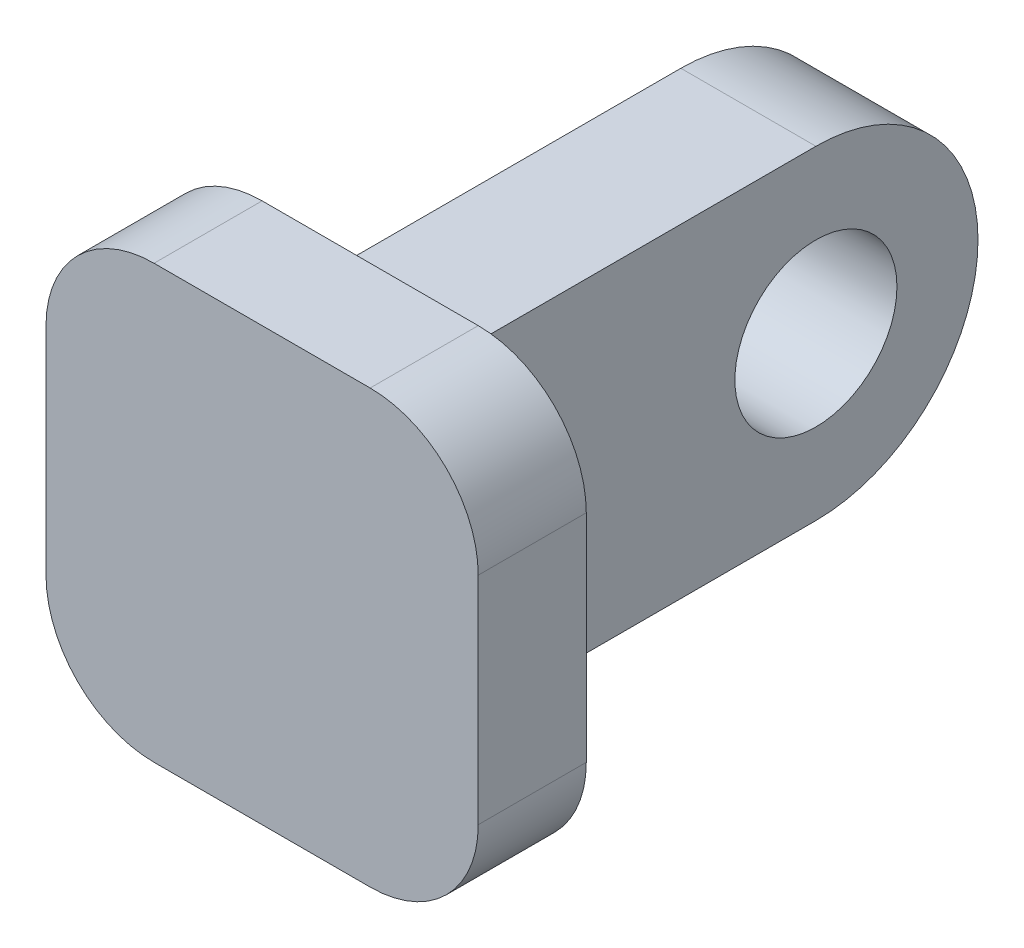
ISO-10303-21;
HEADER;
FILE_DESCRIPTION(('STEP AP214'),'2;1');
FILE_NAME('part.step','',(''),(''),'','','');
FILE_SCHEMA(('AUTOMOTIVE_DESIGN { 1 0 10303 214 1 1 1 1 }'));
ENDSEC;
DATA;
#1=APPLICATION_CONTEXT('core data for automotive mechanical design processes');
#2=APPLICATION_PROTOCOL_DEFINITION('international standard','automotive_design',2000,#1);
#3=PRODUCT_CONTEXT('',#1,'mechanical');
#4=PRODUCT('Part','Part','',(#3));
#5=PRODUCT_RELATED_PRODUCT_CATEGORY('part','',(#4));
#6=PRODUCT_DEFINITION_FORMATION('','',#4);
#7=PRODUCT_DEFINITION_CONTEXT('part definition',#1,'design');
#8=PRODUCT_DEFINITION('design','',#6,#7);
#9=PRODUCT_DEFINITION_SHAPE('','',#8);
#10=(LENGTH_UNIT() NAMED_UNIT(*) SI_UNIT(.MILLI.,.METRE.));
#11=(NAMED_UNIT(*) PLANE_ANGLE_UNIT() SI_UNIT($,.RADIAN.));
#12=(NAMED_UNIT(*) SI_UNIT($,.STERADIAN.) SOLID_ANGLE_UNIT());
#13=UNCERTAINTY_MEASURE_WITH_UNIT(LENGTH_MEASURE(1.E-05),#10,'distance_accuracy_value','');
#14=(GEOMETRIC_REPRESENTATION_CONTEXT(3) GLOBAL_UNCERTAINTY_ASSIGNED_CONTEXT((#13)) GLOBAL_UNIT_ASSIGNED_CONTEXT((#10,
#11,#12)) REPRESENTATION_CONTEXT('',''));
#15=CARTESIAN_POINT('',(0.,0.,0.));
#16=DIRECTION('',(0.,0.,1.));
#17=DIRECTION('',(1.,0.,0.));
#18=AXIS2_PLACEMENT_3D('',#15,#16,#17);
#19=CARTESIAN_POINT('',(-4.,4.,1.));
#20=DIRECTION('',(1.,0.,0.));
#21=DIRECTION('',(0.,1.,0.));
#22=AXIS2_PLACEMENT_3D('',#19,#20,#21);
#23=PLANE('',#22);
#24=DIRECTION('',(0.,-1.,0.));
#25=VECTOR('',#24,1.);
#26=CARTESIAN_POINT('',(-4.,4.,-1.));
#27=LINE('',#26,#25);
#28=CARTESIAN_POINT('',(-4.,2.,-1.));
#29=VERTEX_POINT('',#28);
#30=CARTESIAN_POINT('',(-4.,-2.,-1.));
#31=VERTEX_POINT('',#30);
#32=EDGE_CURVE('E149',#29,#31,#27,.T.);
#33=ORIENTED_EDGE('',*,*,#32,.T.);
#34=DIRECTION('',(0.,0.,-1.));
#35=VECTOR('',#34,1.);
#36=CARTESIAN_POINT('',(-4.,-2.,1.));
#37=LINE('',#36,#35);
#38=CARTESIAN_POINT('',(-4.,-2.,1.));
#39=VERTEX_POINT('',#38);
#40=EDGE_CURVE('E205',#31,#39,#37,.F.);
#41=ORIENTED_EDGE('',*,*,#40,.T.);
#42=DIRECTION('',(0.,-1.,0.));
#43=VECTOR('',#42,1.);
#44=CARTESIAN_POINT('',(-4.,4.,1.));
#45=LINE('',#44,#43);
#46=CARTESIAN_POINT('',(-4.,2.,1.));
#47=VERTEX_POINT('',#46);
#48=EDGE_CURVE('E158',#47,#39,#45,.T.);
#49=ORIENTED_EDGE('',*,*,#48,.F.);
#50=DIRECTION('',(0.,0.,-1.));
#51=VECTOR('',#50,1.);
#52=CARTESIAN_POINT('',(-4.,2.,1.));
#53=LINE('',#52,#51);
#54=EDGE_CURVE('E202',#47,#29,#53,.T.);
#55=ORIENTED_EDGE('',*,*,#54,.T.);
#56=EDGE_LOOP('',(#33,#41,#49,#55));
#57=FACE_BOUND('',#56,.T.);
#58=ADVANCED_FACE('F35',(#57),#23,.F.);
#59=CARTESIAN_POINT('',(-4.,-4.,1.));
#60=DIRECTION('',(0.,1.,0.));
#61=DIRECTION('',(0.,0.,1.));
#62=AXIS2_PLACEMENT_3D('',#59,#60,#61);
#63=PLANE('',#62);
#64=DIRECTION('',(1.,0.,0.));
#65=VECTOR('',#64,1.);
#66=CARTESIAN_POINT('',(-4.,-4.,-1.));
#67=LINE('',#66,#65);
#68=CARTESIAN_POINT('',(-2.,-4.,-1.));
#69=VERTEX_POINT('',#68);
#70=CARTESIAN_POINT('',(2.,-4.,-1.));
#71=VERTEX_POINT('',#70);
#72=EDGE_CURVE('E152',#69,#71,#67,.T.);
#73=ORIENTED_EDGE('',*,*,#72,.T.);
#74=DIRECTION('',(0.,0.,-1.));
#75=VECTOR('',#74,1.);
#76=CARTESIAN_POINT('',(2.,-4.,1.));
#77=LINE('',#76,#75);
#78=CARTESIAN_POINT('',(2.,-4.,1.));
#79=VERTEX_POINT('',#78);
#80=EDGE_CURVE('E192',#71,#79,#77,.F.);
#81=ORIENTED_EDGE('',*,*,#80,.T.);
#82=DIRECTION('',(1.,0.,0.));
#83=VECTOR('',#82,1.);
#84=CARTESIAN_POINT('',(-4.,-4.,1.));
#85=LINE('',#84,#83);
#86=CARTESIAN_POINT('',(-2.,-4.,1.));
#87=VERTEX_POINT('',#86);
#88=EDGE_CURVE('E161',#87,#79,#85,.T.);
#89=ORIENTED_EDGE('',*,*,#88,.F.);
#90=DIRECTION('',(0.,0.,-1.));
#91=VECTOR('',#90,1.);
#92=CARTESIAN_POINT('',(-2.,-4.,1.));
#93=LINE('',#92,#91);
#94=EDGE_CURVE('E189',#87,#69,#93,.T.);
#95=ORIENTED_EDGE('',*,*,#94,.T.);
#96=EDGE_LOOP('',(#73,#81,#89,#95));
#97=FACE_BOUND('',#96,.T.);
#98=ADVANCED_FACE('F231',(#97),#63,.F.);
#99=CARTESIAN_POINT('',(4.,4.,1.));
#100=DIRECTION('',(-1.,0.,0.));
#101=DIRECTION('',(0.,0.,1.));
#102=AXIS2_PLACEMENT_3D('',#99,#100,#101);
#103=PLANE('',#102);
#104=DIRECTION('',(0.,1.,0.));
#105=VECTOR('',#104,1.);
#106=CARTESIAN_POINT('',(4.,4.,1.));
#107=LINE('',#106,#105);
#108=CARTESIAN_POINT('',(4.,-2.,1.));
#109=VERTEX_POINT('',#108);
#110=CARTESIAN_POINT('',(4.,2.,1.));
#111=VERTEX_POINT('',#110);
#112=EDGE_CURVE('E165',#109,#111,#107,.T.);
#113=ORIENTED_EDGE('',*,*,#112,.F.);
#114=DIRECTION('',(0.,0.,-1.));
#115=VECTOR('',#114,1.);
#116=CARTESIAN_POINT('',(4.,-2.,1.));
#117=LINE('',#116,#115);
#118=CARTESIAN_POINT('',(4.,-2.,-1.));
#119=VERTEX_POINT('',#118);
#120=EDGE_CURVE('E178',#109,#119,#117,.T.);
#121=ORIENTED_EDGE('',*,*,#120,.T.);
#122=DIRECTION('',(0.,1.,0.));
#123=VECTOR('',#122,1.);
#124=CARTESIAN_POINT('',(4.,4.,-1.));
#125=LINE('',#124,#123);
#126=CARTESIAN_POINT('',(4.,2.,-1.));
#127=VERTEX_POINT('',#126);
#128=EDGE_CURVE('E173',#119,#127,#125,.T.);
#129=ORIENTED_EDGE('',*,*,#128,.T.);
#130=DIRECTION('',(0.,0.,-1.));
#131=VECTOR('',#130,1.);
#132=CARTESIAN_POINT('',(4.,2.,1.));
#133=LINE('',#132,#131);
#134=EDGE_CURVE('E169',#127,#111,#133,.F.);
#135=ORIENTED_EDGE('',*,*,#134,.T.);
#136=EDGE_LOOP('',(#113,#121,#129,#135));
#137=FACE_BOUND('',#136,.T.);
#138=ADVANCED_FACE('F239',(#137),#103,.F.);
#139=CARTESIAN_POINT('',(-4.,4.,1.));
#140=DIRECTION('',(0.,-1.,0.));
#141=DIRECTION('',(0.,0.,-1.));
#142=AXIS2_PLACEMENT_3D('',#139,#140,#141);
#143=PLANE('',#142);
#144=DIRECTION('',(-1.,0.,0.));
#145=VECTOR('',#144,1.);
#146=CARTESIAN_POINT('',(-4.,4.,-1.));
#147=LINE('',#146,#145);
#148=CARTESIAN_POINT('',(2.,4.,-1.));
#149=VERTEX_POINT('',#148);
#150=CARTESIAN_POINT('',(-2.,4.,-1.));
#151=VERTEX_POINT('',#150);
#152=EDGE_CURVE('E162',#149,#151,#147,.T.);
#153=ORIENTED_EDGE('',*,*,#152,.T.);
#154=DIRECTION('',(0.,0.,-1.));
#155=VECTOR('',#154,1.);
#156=CARTESIAN_POINT('',(-2.,4.,1.));
#157=LINE('',#156,#155);
#158=CARTESIAN_POINT('',(-2.,4.,1.));
#159=VERTEX_POINT('',#158);
#160=EDGE_CURVE('E11',#151,#159,#157,.F.);
#161=ORIENTED_EDGE('',*,*,#160,.T.);
#162=DIRECTION('',(-1.,0.,0.));
#163=VECTOR('',#162,1.);
#164=CARTESIAN_POINT('',(-4.,4.,1.));
#165=LINE('',#164,#163);
#166=CARTESIAN_POINT('',(2.,4.,1.));
#167=VERTEX_POINT('',#166);
#168=EDGE_CURVE('E168',#167,#159,#165,.T.);
#169=ORIENTED_EDGE('',*,*,#168,.F.);
#170=DIRECTION('',(0.,0.,-1.));
#171=VECTOR('',#170,1.);
#172=CARTESIAN_POINT('',(2.,4.,1.));
#173=LINE('',#172,#171);
#174=EDGE_CURVE('E44',#167,#149,#173,.T.);
#175=ORIENTED_EDGE('',*,*,#174,.T.);
#176=EDGE_LOOP('',(#153,#161,#169,#175));
#177=FACE_BOUND('',#176,.T.);
#178=ADVANCED_FACE('F210',(#177),#143,.F.);
#179=CARTESIAN_POINT('',(0.,0.,1.));
#180=DIRECTION('',(0.,0.,1.));
#181=DIRECTION('',(1.,0.,0.));
#182=AXIS2_PLACEMENT_3D('',#179,#180,#181);
#183=PLANE('',#182);
#184=ORIENTED_EDGE('',*,*,#88,.T.);
#185=CARTESIAN_POINT('',(2.,-2.,1.));
#186=DIRECTION('',(0.,0.,1.));
#187=DIRECTION('',(1.,0.,0.));
#188=AXIS2_PLACEMENT_3D('',#185,#186,#187);
#189=CIRCLE('',#188,2.);
#190=EDGE_CURVE('E200',#79,#109,#189,.T.);
#191=ORIENTED_EDGE('',*,*,#190,.T.);
#192=ORIENTED_EDGE('',*,*,#112,.T.);
#193=CARTESIAN_POINT('',(2.,2.,1.));
#194=DIRECTION('',(0.,0.,1.));
#195=DIRECTION('',(1.,0.,0.));
#196=AXIS2_PLACEMENT_3D('',#193,#194,#195);
#197=CIRCLE('',#196,2.);
#198=EDGE_CURVE('E194',#111,#167,#197,.T.);
#199=ORIENTED_EDGE('',*,*,#198,.T.);
#200=ORIENTED_EDGE('',*,*,#168,.T.);
#201=CARTESIAN_POINT('',(-2.,2.,1.));
#202=DIRECTION('',(0.,0.,1.));
#203=DIRECTION('',(1.,0.,0.));
#204=AXIS2_PLACEMENT_3D('',#201,#202,#203);
#205=CIRCLE('',#204,2.);
#206=EDGE_CURVE('E196',#159,#47,#205,.T.);
#207=ORIENTED_EDGE('',*,*,#206,.T.);
#208=ORIENTED_EDGE('',*,*,#48,.T.);
#209=CARTESIAN_POINT('',(-2.,-2.,1.));
#210=DIRECTION('',(0.,0.,1.));
#211=DIRECTION('',(1.,0.,0.));
#212=AXIS2_PLACEMENT_3D('',#209,#210,#211);
#213=CIRCLE('',#212,2.);
#214=EDGE_CURVE('E198',#39,#87,#213,.T.);
#215=ORIENTED_EDGE('',*,*,#214,.T.);
#216=EDGE_LOOP('',(#184,#191,#192,#199,#200,#207,#208,#215));
#217=FACE_BOUND('',#216,.T.);
#218=ADVANCED_FACE('F224',(#217),#183,.T.);
#219=CARTESIAN_POINT('',(0.,0.,-1.));
#220=DIRECTION('',(0.,0.,1.));
#221=DIRECTION('',(1.,0.,0.));
#222=AXIS2_PLACEMENT_3D('',#219,#220,#221);
#223=PLANE('',#222);
#224=DIRECTION('',(-1.,0.,0.));
#225=VECTOR('',#224,1.);
#226=CARTESIAN_POINT('',(1.25,3.,-1.));
#227=LINE('',#226,#225);
#228=CARTESIAN_POINT('',(1.25,3.,-1.));
#229=VERTEX_POINT('',#228);
#230=CARTESIAN_POINT('',(-1.25,3.,-1.));
#231=VERTEX_POINT('',#230);
#232=EDGE_CURVE('E387',#229,#231,#227,.T.);
#233=ORIENTED_EDGE('',*,*,#232,.T.);
#234=DIRECTION('',(0.,-1.,0.));
#235=VECTOR('',#234,1.);
#236=CARTESIAN_POINT('',(-1.25,3.,-1.));
#237=LINE('',#236,#235);
#238=CARTESIAN_POINT('',(-1.25,-3.,-1.));
#239=VERTEX_POINT('',#238);
#240=EDGE_CURVE('E51',#231,#239,#237,.T.);
#241=ORIENTED_EDGE('',*,*,#240,.T.);
#242=DIRECTION('',(-1.,0.,0.));
#243=VECTOR('',#242,1.);
#244=CARTESIAN_POINT('',(1.25,-3.,-1.));
#245=LINE('',#244,#243);
#246=CARTESIAN_POINT('',(1.25,-3.,-1.));
#247=VERTEX_POINT('',#246);
#248=EDGE_CURVE('E130',#247,#239,#245,.T.);
#249=ORIENTED_EDGE('',*,*,#248,.F.);
#250=DIRECTION('',(0.,-1.,0.));
#251=VECTOR('',#250,1.);
#252=CARTESIAN_POINT('',(1.25,3.,-1.));
#253=LINE('',#252,#251);
#254=EDGE_CURVE('E136',#229,#247,#253,.T.);
#255=ORIENTED_EDGE('',*,*,#254,.F.);
#256=EDGE_LOOP('',(#233,#241,#249,#255));
#257=FACE_BOUND('',#256,.T.);
#258=ORIENTED_EDGE('',*,*,#128,.F.);
#259=CARTESIAN_POINT('',(2.,-2.,-1.));
#260=DIRECTION('',(0.,0.,1.));
#261=DIRECTION('',(1.,0.,0.));
#262=AXIS2_PLACEMENT_3D('',#259,#260,#261);
#263=CIRCLE('',#262,2.);
#264=EDGE_CURVE('E187',#119,#71,#263,.F.);
#265=ORIENTED_EDGE('',*,*,#264,.T.);
#266=ORIENTED_EDGE('',*,*,#72,.F.);
#267=CARTESIAN_POINT('',(-2.,-2.,-1.));
#268=DIRECTION('',(0.,0.,1.));
#269=DIRECTION('',(1.,0.,0.));
#270=AXIS2_PLACEMENT_3D('',#267,#268,#269);
#271=CIRCLE('',#270,2.);
#272=EDGE_CURVE('E185',#69,#31,#271,.F.);
#273=ORIENTED_EDGE('',*,*,#272,.T.);
#274=ORIENTED_EDGE('',*,*,#32,.F.);
#275=CARTESIAN_POINT('',(-2.,2.,-1.));
#276=DIRECTION('',(0.,0.,1.));
#277=DIRECTION('',(1.,0.,0.));
#278=AXIS2_PLACEMENT_3D('',#275,#276,#277);
#279=CIRCLE('',#278,2.);
#280=EDGE_CURVE('E183',#29,#151,#279,.F.);
#281=ORIENTED_EDGE('',*,*,#280,.T.);
#282=ORIENTED_EDGE('',*,*,#152,.F.);
#283=CARTESIAN_POINT('',(2.,2.,-1.));
#284=DIRECTION('',(0.,0.,1.));
#285=DIRECTION('',(1.,0.,0.));
#286=AXIS2_PLACEMENT_3D('',#283,#284,#285);
#287=CIRCLE('',#286,2.);
#288=EDGE_CURVE('E181',#149,#127,#287,.F.);
#289=ORIENTED_EDGE('',*,*,#288,.T.);
#290=EDGE_LOOP('',(#258,#265,#266,#273,#274,#281,#282,#289));
#291=FACE_BOUND('',#290,.T.);
#292=ADVANCED_FACE('F147',(#257,#291),#223,.F.);
#293=CARTESIAN_POINT('',(2.,-2.,1.));
#294=DIRECTION('',(0.,0.,-1.));
#295=DIRECTION('',(-1.,0.,0.));
#296=AXIS2_PLACEMENT_3D('',#293,#294,#295);
#297=CYLINDRICAL_SURFACE('',#296,2.);
#298=ORIENTED_EDGE('',*,*,#190,.F.);
#299=ORIENTED_EDGE('',*,*,#80,.F.);
#300=ORIENTED_EDGE('',*,*,#264,.F.);
#301=ORIENTED_EDGE('',*,*,#120,.F.);
#302=EDGE_LOOP('',(#298,#299,#300,#301));
#303=FACE_BOUND('',#302,.T.);
#304=ADVANCED_FACE('F236',(#303),#297,.T.);
#305=CARTESIAN_POINT('',(-2.,-2.,1.));
#306=DIRECTION('',(0.,0.,-1.));
#307=DIRECTION('',(-1.,0.,0.));
#308=AXIS2_PLACEMENT_3D('',#305,#306,#307);
#309=CYLINDRICAL_SURFACE('',#308,2.);
#310=ORIENTED_EDGE('',*,*,#214,.F.);
#311=ORIENTED_EDGE('',*,*,#40,.F.);
#312=ORIENTED_EDGE('',*,*,#272,.F.);
#313=ORIENTED_EDGE('',*,*,#94,.F.);
#314=EDGE_LOOP('',(#310,#311,#312,#313));
#315=FACE_BOUND('',#314,.T.);
#316=ADVANCED_FACE('F228',(#315),#309,.T.);
#317=CARTESIAN_POINT('',(-2.,2.,1.));
#318=DIRECTION('',(0.,0.,-1.));
#319=DIRECTION('',(-1.,0.,0.));
#320=AXIS2_PLACEMENT_3D('',#317,#318,#319);
#321=CYLINDRICAL_SURFACE('',#320,2.);
#322=ORIENTED_EDGE('',*,*,#206,.F.);
#323=ORIENTED_EDGE('',*,*,#160,.F.);
#324=ORIENTED_EDGE('',*,*,#280,.F.);
#325=ORIENTED_EDGE('',*,*,#54,.F.);
#326=EDGE_LOOP('',(#322,#323,#324,#325));
#327=FACE_BOUND('',#326,.T.);
#328=ADVANCED_FACE('F218',(#327),#321,.T.);
#329=CARTESIAN_POINT('',(2.,2.,1.));
#330=DIRECTION('',(0.,0.,-1.));
#331=DIRECTION('',(-1.,0.,0.));
#332=AXIS2_PLACEMENT_3D('',#329,#330,#331);
#333=CYLINDRICAL_SURFACE('',#332,2.);
#334=ORIENTED_EDGE('',*,*,#198,.F.);
#335=ORIENTED_EDGE('',*,*,#134,.F.);
#336=ORIENTED_EDGE('',*,*,#288,.F.);
#337=ORIENTED_EDGE('',*,*,#174,.F.);
#338=EDGE_LOOP('',(#334,#335,#336,#337));
#339=FACE_BOUND('',#338,.T.);
#340=ADVANCED_FACE('F37',(#339),#333,.T.);
#341=CARTESIAN_POINT('',(1.25,-3.,-1.));
#342=DIRECTION('',(0.,1.,0.));
#343=DIRECTION('',(0.,0.,1.));
#344=AXIS2_PLACEMENT_3D('',#341,#342,#343);
#345=PLANE('',#344);
#346=DIRECTION('',(0.,0.,-1.));
#347=VECTOR('',#346,1.);
#348=CARTESIAN_POINT('',(-1.25,-3.,-1.));
#349=LINE('',#348,#347);
#350=CARTESIAN_POINT('',(-1.25,-3.,-8.));
#351=VERTEX_POINT('',#350);
#352=EDGE_CURVE('E383',#239,#351,#349,.T.);
#353=ORIENTED_EDGE('',*,*,#352,.T.);
#354=DIRECTION('',(-1.,0.,0.));
#355=VECTOR('',#354,1.);
#356=CARTESIAN_POINT('',(1.25,-3.,-8.));
#357=LINE('',#356,#355);
#358=CARTESIAN_POINT('',(1.25,-3.,-8.));
#359=VERTEX_POINT('',#358);
#360=EDGE_CURVE('E132',#359,#351,#357,.T.);
#361=ORIENTED_EDGE('',*,*,#360,.F.);
#362=DIRECTION('',(0.,0.,-1.));
#363=VECTOR('',#362,1.);
#364=CARTESIAN_POINT('',(1.25,-3.,-1.));
#365=LINE('',#364,#363);
#366=EDGE_CURVE('E126',#247,#359,#365,.T.);
#367=ORIENTED_EDGE('',*,*,#366,.F.);
#368=ORIENTED_EDGE('',*,*,#248,.T.);
#369=EDGE_LOOP('',(#353,#361,#367,#368));
#370=FACE_BOUND('',#369,.T.);
#371=ADVANCED_FACE('F128',(#370),#345,.F.);
#372=CARTESIAN_POINT('',(1.25,0.,-8.));
#373=DIRECTION('',(-1.,0.,0.));
#374=DIRECTION('',(0.,0.,1.));
#375=AXIS2_PLACEMENT_3D('',#372,#373,#374);
#376=CYLINDRICAL_SURFACE('',#375,3.);
#377=CARTESIAN_POINT('',(-1.25,0.,-8.));
#378=DIRECTION('',(1.,0.,0.));
#379=DIRECTION('',(0.,0.,-1.));
#380=AXIS2_PLACEMENT_3D('',#377,#378,#379);
#381=CIRCLE('',#380,3.);
#382=CARTESIAN_POINT('',(-1.25,3.,-8.));
#383=VERTEX_POINT('',#382);
#384=EDGE_CURVE('E390',#351,#383,#381,.T.);
#385=ORIENTED_EDGE('',*,*,#384,.T.);
#386=DIRECTION('',(-1.,0.,0.));
#387=VECTOR('',#386,1.);
#388=CARTESIAN_POINT('',(1.25,3.,-8.));
#389=LINE('',#388,#387);
#390=CARTESIAN_POINT('',(1.25,3.,-8.));
#391=VERTEX_POINT('',#390);
#392=EDGE_CURVE('E154',#391,#383,#389,.T.);
#393=ORIENTED_EDGE('',*,*,#392,.F.);
#394=CARTESIAN_POINT('',(1.25,0.,-8.));
#395=DIRECTION('',(1.,0.,0.));
#396=DIRECTION('',(0.,0.,-1.));
#397=AXIS2_PLACEMENT_3D('',#394,#395,#396);
#398=CIRCLE('',#397,3.);
#399=EDGE_CURVE('E135',#359,#391,#398,.T.);
#400=ORIENTED_EDGE('',*,*,#399,.F.);
#401=ORIENTED_EDGE('',*,*,#360,.T.);
#402=EDGE_LOOP('',(#385,#393,#400,#401));
#403=FACE_BOUND('',#402,.T.);
#404=ADVANCED_FACE('F246',(#403),#376,.T.);
#405=CARTESIAN_POINT('',(1.25,3.,-1.));
#406=DIRECTION('',(0.,-1.,0.));
#407=DIRECTION('',(0.,0.,-1.));
#408=AXIS2_PLACEMENT_3D('',#405,#406,#407);
#409=PLANE('',#408);
#410=DIRECTION('',(0.,0.,1.));
#411=VECTOR('',#410,1.);
#412=CARTESIAN_POINT('',(-1.25,3.,-1.));
#413=LINE('',#412,#411);
#414=EDGE_CURVE('E145',#383,#231,#413,.T.);
#415=ORIENTED_EDGE('',*,*,#414,.T.);
#416=ORIENTED_EDGE('',*,*,#232,.F.);
#417=DIRECTION('',(0.,0.,1.));
#418=VECTOR('',#417,1.);
#419=CARTESIAN_POINT('',(1.25,3.,-1.));
#420=LINE('',#419,#418);
#421=EDGE_CURVE('E141',#391,#229,#420,.T.);
#422=ORIENTED_EDGE('',*,*,#421,.F.);
#423=ORIENTED_EDGE('',*,*,#392,.T.);
#424=EDGE_LOOP('',(#415,#416,#422,#423));
#425=FACE_BOUND('',#424,.T.);
#426=ADVANCED_FACE('F297',(#425),#409,.F.);
#427=CARTESIAN_POINT('',(1.25,0.,-8.));
#428=DIRECTION('',(1.,0.,0.));
#429=DIRECTION('',(0.,0.,-1.));
#430=AXIS2_PLACEMENT_3D('',#427,#428,#429);
#431=PLANE('',#430);
#432=CARTESIAN_POINT('',(1.25,0.,-8.));
#433=DIRECTION('',(1.,0.,0.));
#434=DIRECTION('',(0.,0.,-1.));
#435=AXIS2_PLACEMENT_3D('',#432,#433,#434);
#436=CIRCLE('',#435,1.5);
#437=CARTESIAN_POINT('',(1.25,0.,-9.5));
#438=VERTEX_POINT('',#437);
#439=EDGE_CURVE('E379',#438,#438,#436,.T.);
#440=ORIENTED_EDGE('',*,*,#439,.F.);
#441=EDGE_LOOP('',(#440));
#442=FACE_BOUND('',#441,.T.);
#443=ORIENTED_EDGE('',*,*,#254,.T.);
#444=ORIENTED_EDGE('',*,*,#366,.T.);
#445=ORIENTED_EDGE('',*,*,#399,.T.);
#446=ORIENTED_EDGE('',*,*,#421,.T.);
#447=EDGE_LOOP('',(#443,#444,#445,#446));
#448=FACE_BOUND('',#447,.T.);
#449=ADVANCED_FACE('F139',(#442,#448),#431,.T.);
#450=CARTESIAN_POINT('',(-1.25,0.,-8.));
#451=DIRECTION('',(1.,0.,0.));
#452=DIRECTION('',(0.,0.,-1.));
#453=AXIS2_PLACEMENT_3D('',#450,#451,#452);
#454=PLANE('',#453);
#455=CARTESIAN_POINT('',(-1.25,0.,-8.));
#456=DIRECTION('',(1.,0.,0.));
#457=DIRECTION('',(0.,0.,-1.));
#458=AXIS2_PLACEMENT_3D('',#455,#456,#457);
#459=CIRCLE('',#458,1.5);
#460=CARTESIAN_POINT('',(-1.25,0.,-9.5));
#461=VERTEX_POINT('',#460);
#462=EDGE_CURVE('E39',#461,#461,#459,.T.);
#463=ORIENTED_EDGE('',*,*,#462,.T.);
#464=EDGE_LOOP('',(#463));
#465=FACE_BOUND('',#464,.T.);
#466=ORIENTED_EDGE('',*,*,#240,.F.);
#467=ORIENTED_EDGE('',*,*,#414,.F.);
#468=ORIENTED_EDGE('',*,*,#384,.F.);
#469=ORIENTED_EDGE('',*,*,#352,.F.);
#470=EDGE_LOOP('',(#466,#467,#468,#469));
#471=FACE_BOUND('',#470,.T.);
#472=ADVANCED_FACE('F316',(#465,#471),#454,.F.);
#473=CARTESIAN_POINT('',(-4.,0.,-8.));
#474=DIRECTION('',(1.,0.,0.));
#475=DIRECTION('',(0.,0.,-1.));
#476=AXIS2_PLACEMENT_3D('',#473,#474,#475);
#477=CYLINDRICAL_SURFACE('',#476,1.5);
#478=ORIENTED_EDGE('',*,*,#439,.T.);
#479=EDGE_LOOP('',(#478));
#480=FACE_BOUND('',#479,.T.);
#481=ORIENTED_EDGE('',*,*,#462,.F.);
#482=EDGE_LOOP('',(#481));
#483=FACE_BOUND('',#482,.T.);
#484=ADVANCED_FACE('F326',(#480,#483),#477,.F.);
#485=CLOSED_SHELL('',(#58,#98,#138,#178,#218,#292,#304,#316,#328,#340,#371,#404,#426,#449,#472,#484));
#486=MANIFOLD_SOLID_BREP('B2',#485);
#487=ADVANCED_BREP_SHAPE_REPRESENTATION('',(#18,#486),#14);
#488=SHAPE_DEFINITION_REPRESENTATION(#9,#487);
ENDSEC;
END-ISO-10303-21;
